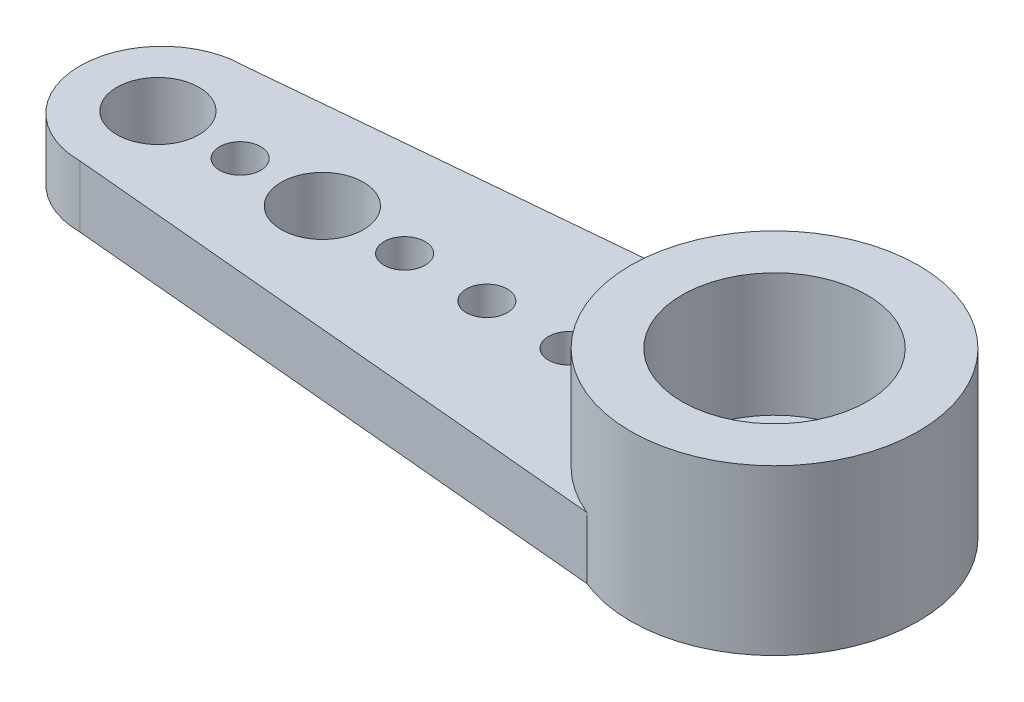
ISO-10303-21;
HEADER;
FILE_DESCRIPTION(('STEP AP214'),'2;1');
FILE_NAME('part.step','',(''),(''),'','','');
FILE_SCHEMA(('AUTOMOTIVE_DESIGN { 1 0 10303 214 1 1 1 1 }'));
ENDSEC;
DATA;
#1=APPLICATION_CONTEXT('core data for automotive mechanical design processes');
#2=APPLICATION_PROTOCOL_DEFINITION('international standard','automotive_design',2000,#1);
#3=PRODUCT_CONTEXT('',#1,'mechanical');
#4=PRODUCT('Part','Part','',(#3));
#5=PRODUCT_RELATED_PRODUCT_CATEGORY('part','',(#4));
#6=PRODUCT_DEFINITION_FORMATION('','',#4);
#7=PRODUCT_DEFINITION_CONTEXT('part definition',#1,'design');
#8=PRODUCT_DEFINITION('design','',#6,#7);
#9=PRODUCT_DEFINITION_SHAPE('','',#8);
#10=(LENGTH_UNIT() NAMED_UNIT(*) SI_UNIT(.MILLI.,.METRE.));
#11=(NAMED_UNIT(*) PLANE_ANGLE_UNIT() SI_UNIT($,.RADIAN.));
#12=(NAMED_UNIT(*) SI_UNIT($,.STERADIAN.) SOLID_ANGLE_UNIT());
#13=UNCERTAINTY_MEASURE_WITH_UNIT(LENGTH_MEASURE(1.E-05),#10,'distance_accuracy_value','');
#14=(GEOMETRIC_REPRESENTATION_CONTEXT(3) GLOBAL_UNCERTAINTY_ASSIGNED_CONTEXT((#13)) GLOBAL_UNIT_ASSIGNED_CONTEXT((#10,
#11,#12)) REPRESENTATION_CONTEXT('',''));
#15=CARTESIAN_POINT('',(0.,0.,0.));
#16=DIRECTION('',(0.,0.,1.));
#17=DIRECTION('',(1.,0.,0.));
#18=AXIS2_PLACEMENT_3D('',#15,#16,#17);
#19=CARTESIAN_POINT('',(0.,4.,0.));
#20=DIRECTION('',(0.,-1.,0.));
#21=DIRECTION('',(0.,0.,-1.));
#22=AXIS2_PLACEMENT_3D('',#19,#20,#21);
#23=CYLINDRICAL_SURFACE('',#22,3.5);
#24=CARTESIAN_POINT('',(0.,0.,0.));
#25=DIRECTION('',(0.,1.,0.));
#26=DIRECTION('',(0.,0.,1.));
#27=AXIS2_PLACEMENT_3D('',#24,#25,#26);
#28=CIRCLE('',#27,3.5);
#29=CARTESIAN_POINT('',(-1.32419778955484,0.,3.23983027551415));
#30=VERTEX_POINT('',#29);
#31=CARTESIAN_POINT('',(-1.32419778955674,0.,-3.23983027551337));
#32=VERTEX_POINT('',#31);
#33=EDGE_CURVE('E116',#30,#32,#28,.T.);
#34=ORIENTED_EDGE('',*,*,#33,.T.);
#35=DIRECTION('',(0.,-1.,0.));
#36=VECTOR('',#35,1.);
#37=CARTESIAN_POINT('',(-1.32419778955674,4.,-3.23983027551337));
#38=LINE('',#37,#36);
#39=CARTESIAN_POINT('',(-1.32419778955674,1.5,-3.23983027551337));
#40=VERTEX_POINT('',#39);
#41=EDGE_CURVE('E55',#40,#32,#38,.T.);
#42=ORIENTED_EDGE('',*,*,#41,.F.);
#43=CARTESIAN_POINT('',(0.,1.5,0.));
#44=DIRECTION('',(0.,-1.,0.));
#45=DIRECTION('',(0.,0.,-1.));
#46=AXIS2_PLACEMENT_3D('',#43,#44,#45);
#47=CIRCLE('',#46,3.5);
#48=CARTESIAN_POINT('',(-1.32419778955484,1.5,3.23983027551415));
#49=VERTEX_POINT('',#48);
#50=EDGE_CURVE('E11',#49,#40,#47,.T.);
#51=ORIENTED_EDGE('',*,*,#50,.F.);
#52=DIRECTION('',(0.,-1.,0.));
#53=VECTOR('',#52,1.);
#54=CARTESIAN_POINT('',(-1.32419778955484,4.,3.23983027551415));
#55=LINE('',#54,#53);
#56=EDGE_CURVE('E114',#30,#49,#55,.F.);
#57=ORIENTED_EDGE('',*,*,#56,.F.);
#58=EDGE_LOOP('',(#34,#42,#51,#57));
#59=FACE_BOUND('',#58,.T.);
#60=CARTESIAN_POINT('',(0.,4.,0.));
#61=DIRECTION('',(0.,1.,0.));
#62=DIRECTION('',(0.,0.,1.));
#63=AXIS2_PLACEMENT_3D('',#60,#61,#62);
#64=CIRCLE('',#63,3.5);
#65=CARTESIAN_POINT('',(0.,4.,3.5));
#66=VERTEX_POINT('',#65);
#67=EDGE_CURVE('E47',#66,#66,#64,.T.);
#68=ORIENTED_EDGE('',*,*,#67,.F.);
#69=EDGE_LOOP('',(#68));
#70=FACE_BOUND('',#69,.T.);
#71=ADVANCED_FACE('F39',(#59,#70),#23,.T.);
#72=CARTESIAN_POINT('',(0.,4.,0.));
#73=DIRECTION('',(0.,1.,0.));
#74=DIRECTION('',(0.,0.,1.));
#75=AXIS2_PLACEMENT_3D('',#72,#73,#74);
#76=PLANE('',#75);
#77=CARTESIAN_POINT('',(0.,4.,0.));
#78=DIRECTION('',(0.,1.,0.));
#79=DIRECTION('',(0.,0.,1.));
#80=AXIS2_PLACEMENT_3D('',#77,#78,#79);
#81=CIRCLE('',#80,2.25);
#82=CARTESIAN_POINT('',(0.,4.,2.25));
#83=VERTEX_POINT('',#82);
#84=EDGE_CURVE('E123',#83,#83,#81,.T.);
#85=ORIENTED_EDGE('',*,*,#84,.F.);
#86=EDGE_LOOP('',(#85));
#87=FACE_BOUND('',#86,.T.);
#88=ORIENTED_EDGE('',*,*,#67,.T.);
#89=EDGE_LOOP('',(#88));
#90=FACE_BOUND('',#89,.T.);
#91=ADVANCED_FACE('F178',(#87,#90),#76,.T.);
#92=CARTESIAN_POINT('',(0.,0.,0.));
#93=DIRECTION('',(0.,1.,0.));
#94=DIRECTION('',(0.,0.,1.));
#95=AXIS2_PLACEMENT_3D('',#92,#93,#94);
#96=PLANE('',#95);
#97=CARTESIAN_POINT('',(-5.,0.,0.));
#98=DIRECTION('',(0.,-1.,0.));
#99=DIRECTION('',(0.,0.,-1.));
#100=AXIS2_PLACEMENT_3D('',#97,#98,#99);
#101=CIRCLE('',#100,0.499999999999999);
#102=CARTESIAN_POINT('',(-5.,0.,-0.499999999999999));
#103=VERTEX_POINT('',#102);
#104=EDGE_CURVE('E152',#103,#103,#101,.T.);
#105=ORIENTED_EDGE('',*,*,#104,.F.);
#106=EDGE_LOOP('',(#105));
#107=FACE_BOUND('',#106,.T.);
#108=CARTESIAN_POINT('',(-7.,0.,0.));
#109=DIRECTION('',(0.,-1.,0.));
#110=DIRECTION('',(0.,0.,-1.));
#111=AXIS2_PLACEMENT_3D('',#108,#109,#110);
#112=CIRCLE('',#111,0.499999999999999);
#113=CARTESIAN_POINT('',(-7.,0.,-0.499999999999999));
#114=VERTEX_POINT('',#113);
#115=EDGE_CURVE('E142',#114,#114,#112,.T.);
#116=ORIENTED_EDGE('',*,*,#115,.F.);
#117=EDGE_LOOP('',(#116));
#118=FACE_BOUND('',#117,.T.);
#119=CARTESIAN_POINT('',(-9.,0.,0.));
#120=DIRECTION('',(0.,-1.,0.));
#121=DIRECTION('',(0.,0.,-1.));
#122=AXIS2_PLACEMENT_3D('',#119,#120,#121);
#123=CIRCLE('',#122,0.499999999999999);
#124=CARTESIAN_POINT('',(-9.,0.,-0.499999999999999));
#125=VERTEX_POINT('',#124);
#126=EDGE_CURVE('E139',#125,#125,#123,.T.);
#127=ORIENTED_EDGE('',*,*,#126,.F.);
#128=EDGE_LOOP('',(#127));
#129=FACE_BOUND('',#128,.T.);
#130=CARTESIAN_POINT('',(-11.,0.,0.));
#131=DIRECTION('',(0.,-1.,0.));
#132=DIRECTION('',(0.,0.,-1.));
#133=AXIS2_PLACEMENT_3D('',#130,#131,#132);
#134=CIRCLE('',#133,1.);
#135=CARTESIAN_POINT('',(-11.,0.,-1.));
#136=VERTEX_POINT('',#135);
#137=EDGE_CURVE('E136',#136,#136,#134,.T.);
#138=ORIENTED_EDGE('',*,*,#137,.F.);
#139=EDGE_LOOP('',(#138));
#140=FACE_BOUND('',#139,.T.);
#141=CARTESIAN_POINT('',(-13.,0.,0.));
#142=DIRECTION('',(0.,-1.,0.));
#143=DIRECTION('',(0.,0.,-1.));
#144=AXIS2_PLACEMENT_3D('',#141,#142,#143);
#145=CIRCLE('',#144,0.499999999999999);
#146=CARTESIAN_POINT('',(-13.,0.,-0.499999999999999));
#147=VERTEX_POINT('',#146);
#148=EDGE_CURVE('E132',#147,#147,#145,.T.);
#149=ORIENTED_EDGE('',*,*,#148,.F.);
#150=EDGE_LOOP('',(#149));
#151=FACE_BOUND('',#150,.T.);
#152=CARTESIAN_POINT('',(-15.,0.,0.));
#153=DIRECTION('',(0.,-1.,0.));
#154=DIRECTION('',(0.,0.,-1.));
#155=AXIS2_PLACEMENT_3D('',#152,#153,#154);
#156=CIRCLE('',#155,1.);
#157=CARTESIAN_POINT('',(-15.,0.,-1.));
#158=VERTEX_POINT('',#157);
#159=EDGE_CURVE('E128',#158,#158,#156,.T.);
#160=ORIENTED_EDGE('',*,*,#159,.F.);
#161=EDGE_LOOP('',(#160));
#162=FACE_BOUND('',#161,.T.);
#163=CARTESIAN_POINT('',(0.,0.,0.));
#164=DIRECTION('',(0.,-1.,0.));
#165=DIRECTION('',(0.,0.,-1.));
#166=AXIS2_PLACEMENT_3D('',#163,#164,#165);
#167=CIRCLE('',#166,2.5);
#168=CARTESIAN_POINT('',(0.,0.,-2.5));
#169=VERTEX_POINT('',#168);
#170=EDGE_CURVE('E104',#169,#169,#167,.T.);
#171=ORIENTED_EDGE('',*,*,#170,.F.);
#172=EDGE_LOOP('',(#171));
#173=FACE_BOUND('',#172,.T.);
#174=ORIENTED_EDGE('',*,*,#33,.F.);
#175=DIRECTION('',(0.995855643356441,0.,0.0909479939038128));
#176=VECTOR('',#175,1.);
#177=CARTESIAN_POINT('',(-14.9,0.,2.));
#178=LINE('',#177,#176);
#179=CARTESIAN_POINT('',(-14.9,0.,2.));
#180=VERTEX_POINT('',#179);
#181=EDGE_CURVE('E99',#180,#30,#178,.T.);
#182=ORIENTED_EDGE('',*,*,#181,.F.);
#183=CARTESIAN_POINT('',(-14.9,0.,0.));
#184=DIRECTION('',(0.,-1.,0.));
#185=DIRECTION('',(0.,0.,-1.));
#186=AXIS2_PLACEMENT_3D('',#183,#184,#185);
#187=CIRCLE('',#186,2.);
#188=CARTESIAN_POINT('',(-14.9,0.,-2.));
#189=VERTEX_POINT('',#188);
#190=EDGE_CURVE('E108',#180,#189,#187,.T.);
#191=ORIENTED_EDGE('',*,*,#190,.T.);
#192=DIRECTION('',(-0.995855643356445,0.,0.090947993903769));
#193=VECTOR('',#192,1.);
#194=CARTESIAN_POINT('',(-0.6499999999969,0.,-3.30140238876481));
#195=LINE('',#194,#193);
#196=EDGE_CURVE('E91',#32,#189,#195,.T.);
#197=ORIENTED_EDGE('',*,*,#196,.F.);
#198=EDGE_LOOP('',(#174,#182,#191,#197));
#199=FACE_BOUND('',#198,.T.);
#200=ADVANCED_FACE('F175',(#107,#118,#129,#140,#151,#162,#173,#199),#96,.F.);
#201=CARTESIAN_POINT('',(-14.9,1.5,0.));
#202=DIRECTION('',(0.,-1.,0.));
#203=DIRECTION('',(0.,0.,-1.));
#204=AXIS2_PLACEMENT_3D('',#201,#202,#203);
#205=PLANE('',#204);
#206=CARTESIAN_POINT('',(-5.,1.5,0.));
#207=DIRECTION('',(0.,-1.,0.));
#208=DIRECTION('',(0.,0.,-1.));
#209=AXIS2_PLACEMENT_3D('',#206,#207,#208);
#210=CIRCLE('',#209,0.499999999999999);
#211=CARTESIAN_POINT('',(-5.,1.5,-0.499999999999999));
#212=VERTEX_POINT('',#211);
#213=EDGE_CURVE('E42',#212,#212,#210,.T.);
#214=ORIENTED_EDGE('',*,*,#213,.T.);
#215=EDGE_LOOP('',(#214));
#216=FACE_BOUND('',#215,.T.);
#217=CARTESIAN_POINT('',(-7.,1.5,0.));
#218=DIRECTION('',(0.,-1.,0.));
#219=DIRECTION('',(0.,0.,-1.));
#220=AXIS2_PLACEMENT_3D('',#217,#218,#219);
#221=CIRCLE('',#220,0.499999999999999);
#222=CARTESIAN_POINT('',(-7.,1.5,-0.499999999999999));
#223=VERTEX_POINT('',#222);
#224=EDGE_CURVE('E140',#223,#223,#221,.T.);
#225=ORIENTED_EDGE('',*,*,#224,.T.);
#226=EDGE_LOOP('',(#225));
#227=FACE_BOUND('',#226,.T.);
#228=CARTESIAN_POINT('',(-9.,1.5,0.));
#229=DIRECTION('',(0.,-1.,0.));
#230=DIRECTION('',(0.,0.,-1.));
#231=AXIS2_PLACEMENT_3D('',#228,#229,#230);
#232=CIRCLE('',#231,0.499999999999999);
#233=CARTESIAN_POINT('',(-9.,1.5,-0.499999999999999));
#234=VERTEX_POINT('',#233);
#235=EDGE_CURVE('E137',#234,#234,#232,.T.);
#236=ORIENTED_EDGE('',*,*,#235,.T.);
#237=EDGE_LOOP('',(#236));
#238=FACE_BOUND('',#237,.T.);
#239=CARTESIAN_POINT('',(-11.,1.5,0.));
#240=DIRECTION('',(0.,-1.,0.));
#241=DIRECTION('',(0.,0.,-1.));
#242=AXIS2_PLACEMENT_3D('',#239,#240,#241);
#243=CIRCLE('',#242,1.);
#244=CARTESIAN_POINT('',(-11.,1.5,-1.));
#245=VERTEX_POINT('',#244);
#246=EDGE_CURVE('E133',#245,#245,#243,.T.);
#247=ORIENTED_EDGE('',*,*,#246,.T.);
#248=EDGE_LOOP('',(#247));
#249=FACE_BOUND('',#248,.T.);
#250=CARTESIAN_POINT('',(-13.,1.5,0.));
#251=DIRECTION('',(0.,-1.,0.));
#252=DIRECTION('',(0.,0.,-1.));
#253=AXIS2_PLACEMENT_3D('',#250,#251,#252);
#254=CIRCLE('',#253,0.499999999999999);
#255=CARTESIAN_POINT('',(-13.,1.5,-0.499999999999999));
#256=VERTEX_POINT('',#255);
#257=EDGE_CURVE('E129',#256,#256,#254,.T.);
#258=ORIENTED_EDGE('',*,*,#257,.T.);
#259=EDGE_LOOP('',(#258));
#260=FACE_BOUND('',#259,.T.);
#261=CARTESIAN_POINT('',(-15.,1.5,0.));
#262=DIRECTION('',(0.,-1.,0.));
#263=DIRECTION('',(0.,0.,-1.));
#264=AXIS2_PLACEMENT_3D('',#261,#262,#263);
#265=CIRCLE('',#264,1.);
#266=CARTESIAN_POINT('',(-15.,1.5,-1.));
#267=VERTEX_POINT('',#266);
#268=EDGE_CURVE('E125',#267,#267,#265,.T.);
#269=ORIENTED_EDGE('',*,*,#268,.T.);
#270=EDGE_LOOP('',(#269));
#271=FACE_BOUND('',#270,.T.);
#272=DIRECTION('',(0.995855643356441,0.,0.0909479939038128));
#273=VECTOR('',#272,1.);
#274=CARTESIAN_POINT('',(-14.9,1.5,2.));
#275=LINE('',#274,#273);
#276=CARTESIAN_POINT('',(-14.9,1.5,2.));
#277=VERTEX_POINT('',#276);
#278=EDGE_CURVE('E85',#277,#49,#275,.T.);
#279=ORIENTED_EDGE('',*,*,#278,.T.);
#280=ORIENTED_EDGE('',*,*,#50,.T.);
#281=DIRECTION('',(-0.995855643356445,0.,0.090947993903769));
#282=VECTOR('',#281,1.);
#283=CARTESIAN_POINT('',(-0.6499999999969,1.5,-3.30140238876481));
#284=LINE('',#283,#282);
#285=CARTESIAN_POINT('',(-14.9,1.5,-2.));
#286=VERTEX_POINT('',#285);
#287=EDGE_CURVE('E78',#40,#286,#284,.T.);
#288=ORIENTED_EDGE('',*,*,#287,.T.);
#289=CARTESIAN_POINT('',(-14.9,1.5,0.));
#290=DIRECTION('',(0.,-1.,0.));
#291=DIRECTION('',(0.,0.,-1.));
#292=AXIS2_PLACEMENT_3D('',#289,#290,#291);
#293=CIRCLE('',#292,2.);
#294=EDGE_CURVE('E83',#277,#286,#293,.T.);
#295=ORIENTED_EDGE('',*,*,#294,.F.);
#296=EDGE_LOOP('',(#279,#280,#288,#295));
#297=FACE_BOUND('',#296,.T.);
#298=ADVANCED_FACE('F81',(#216,#227,#238,#249,#260,#271,#297),#205,.F.);
#299=CARTESIAN_POINT('',(-14.9,1.5,2.));
#300=DIRECTION('',(0.0909479939038128,0.,-0.995855643356442));
#301=DIRECTION('',(-0.995855643356442,0.,-0.0909479939038128));
#302=AXIS2_PLACEMENT_3D('',#299,#300,#301);
#303=PLANE('',#302);
#304=ORIENTED_EDGE('',*,*,#181,.T.);
#305=ORIENTED_EDGE('',*,*,#56,.T.);
#306=ORIENTED_EDGE('',*,*,#278,.F.);
#307=DIRECTION('',(0.,-1.,0.));
#308=VECTOR('',#307,1.);
#309=CARTESIAN_POINT('',(-14.9,1.5,2.));
#310=LINE('',#309,#308);
#311=EDGE_CURVE('E95',#277,#180,#310,.T.);
#312=ORIENTED_EDGE('',*,*,#311,.T.);
#313=EDGE_LOOP('',(#304,#305,#306,#312));
#314=FACE_BOUND('',#313,.T.);
#315=ADVANCED_FACE('F183',(#314),#303,.F.);
#316=CARTESIAN_POINT('',(-0.6499999999969,1.5,-3.30140238876481));
#317=DIRECTION('',(0.090947993903769,0.,0.995855643356445));
#318=DIRECTION('',(0.995855643356445,0.,-0.090947993903769));
#319=AXIS2_PLACEMENT_3D('',#316,#317,#318);
#320=PLANE('',#319);
#321=ORIENTED_EDGE('',*,*,#287,.F.);
#322=ORIENTED_EDGE('',*,*,#41,.T.);
#323=ORIENTED_EDGE('',*,*,#196,.T.);
#324=DIRECTION('',(0.,-1.,0.));
#325=VECTOR('',#324,1.);
#326=CARTESIAN_POINT('',(-14.9,1.5,-2.));
#327=LINE('',#326,#325);
#328=EDGE_CURVE('E88',#286,#189,#327,.T.);
#329=ORIENTED_EDGE('',*,*,#328,.F.);
#330=EDGE_LOOP('',(#321,#322,#323,#329));
#331=FACE_BOUND('',#330,.T.);
#332=ADVANCED_FACE('F89',(#331),#320,.F.);
#333=CARTESIAN_POINT('',(-14.9,1.5,0.));
#334=DIRECTION('',(0.,-1.,0.));
#335=DIRECTION('',(0.,0.,-1.));
#336=AXIS2_PLACEMENT_3D('',#333,#334,#335);
#337=CYLINDRICAL_SURFACE('',#336,2.);
#338=ORIENTED_EDGE('',*,*,#190,.F.);
#339=ORIENTED_EDGE('',*,*,#311,.F.);
#340=ORIENTED_EDGE('',*,*,#294,.T.);
#341=ORIENTED_EDGE('',*,*,#328,.T.);
#342=EDGE_LOOP('',(#338,#339,#340,#341));
#343=FACE_BOUND('',#342,.T.);
#344=ADVANCED_FACE('F97',(#343),#337,.T.);
#345=CARTESIAN_POINT('',(0.,0.6,0.));
#346=DIRECTION('',(0.,-1.,0.));
#347=DIRECTION('',(0.,0.,-1.));
#348=AXIS2_PLACEMENT_3D('',#345,#346,#347);
#349=CYLINDRICAL_SURFACE('',#348,2.5);
#350=CARTESIAN_POINT('',(0.,0.6,0.));
#351=DIRECTION('',(0.,-1.,0.));
#352=DIRECTION('',(0.,0.,-1.));
#353=AXIS2_PLACEMENT_3D('',#350,#351,#352);
#354=CIRCLE('',#353,2.5);
#355=CARTESIAN_POINT('',(0.,0.6,-2.5));
#356=VERTEX_POINT('',#355);
#357=EDGE_CURVE('E110',#356,#356,#354,.T.);
#358=ORIENTED_EDGE('',*,*,#357,.F.);
#359=EDGE_LOOP('',(#358));
#360=FACE_BOUND('',#359,.T.);
#361=ORIENTED_EDGE('',*,*,#170,.T.);
#362=EDGE_LOOP('',(#361));
#363=FACE_BOUND('',#362,.T.);
#364=ADVANCED_FACE('F173',(#360,#363),#349,.F.);
#365=CARTESIAN_POINT('',(0.,0.6,0.));
#366=DIRECTION('',(0.,-1.,0.));
#367=DIRECTION('',(0.,0.,-1.));
#368=AXIS2_PLACEMENT_3D('',#365,#366,#367);
#369=PLANE('',#368);
#370=CARTESIAN_POINT('',(0.,0.6,0.));
#371=DIRECTION('',(0.,-1.,0.));
#372=DIRECTION('',(0.,0.,-1.));
#373=AXIS2_PLACEMENT_3D('',#370,#371,#372);
#374=CIRCLE('',#373,1.);
#375=CARTESIAN_POINT('',(0.,0.6,-1.));
#376=VERTEX_POINT('',#375);
#377=EDGE_CURVE('E124',#376,#376,#374,.T.);
#378=ORIENTED_EDGE('',*,*,#377,.F.);
#379=EDGE_LOOP('',(#378));
#380=FACE_BOUND('',#379,.T.);
#381=ORIENTED_EDGE('',*,*,#357,.T.);
#382=EDGE_LOOP('',(#381));
#383=FACE_BOUND('',#382,.T.);
#384=ADVANCED_FACE('F209',(#380,#383),#369,.T.);
#385=CARTESIAN_POINT('',(0.,1.,0.));
#386=DIRECTION('',(0.,1.,0.));
#387=DIRECTION('',(0.,0.,1.));
#388=AXIS2_PLACEMENT_3D('',#385,#386,#387);
#389=CYLINDRICAL_SURFACE('',#388,2.25);
#390=CARTESIAN_POINT('',(0.,1.,0.));
#391=DIRECTION('',(0.,1.,0.));
#392=DIRECTION('',(0.,0.,1.));
#393=AXIS2_PLACEMENT_3D('',#390,#391,#392);
#394=CIRCLE('',#393,2.25);
#395=CARTESIAN_POINT('',(0.,1.,2.25));
#396=VERTEX_POINT('',#395);
#397=EDGE_CURVE('E163',#396,#396,#394,.T.);
#398=ORIENTED_EDGE('',*,*,#397,.F.);
#399=EDGE_LOOP('',(#398));
#400=FACE_BOUND('',#399,.T.);
#401=ORIENTED_EDGE('',*,*,#84,.T.);
#402=EDGE_LOOP('',(#401));
#403=FACE_BOUND('',#402,.T.);
#404=ADVANCED_FACE('F215',(#400,#403),#389,.F.);
#405=CARTESIAN_POINT('',(0.,1.,0.));
#406=DIRECTION('',(0.,1.,0.));
#407=DIRECTION('',(0.,0.,1.));
#408=AXIS2_PLACEMENT_3D('',#405,#406,#407);
#409=PLANE('',#408);
#410=CARTESIAN_POINT('',(0.,1.,0.));
#411=DIRECTION('',(0.,1.,0.));
#412=DIRECTION('',(0.,0.,1.));
#413=AXIS2_PLACEMENT_3D('',#410,#411,#412);
#414=CIRCLE('',#413,1.);
#415=CARTESIAN_POINT('',(0.,1.,1.));
#416=VERTEX_POINT('',#415);
#417=EDGE_CURVE('E120',#416,#416,#414,.T.);
#418=ORIENTED_EDGE('',*,*,#417,.F.);
#419=EDGE_LOOP('',(#418));
#420=FACE_BOUND('',#419,.T.);
#421=ORIENTED_EDGE('',*,*,#397,.T.);
#422=EDGE_LOOP('',(#421));
#423=FACE_BOUND('',#422,.T.);
#424=ADVANCED_FACE('F220',(#420,#423),#409,.T.);
#425=CARTESIAN_POINT('',(0.,4.,0.));
#426=DIRECTION('',(0.,-1.,0.));
#427=DIRECTION('',(0.,0.,-1.));
#428=AXIS2_PLACEMENT_3D('',#425,#426,#427);
#429=CYLINDRICAL_SURFACE('',#428,1.);
#430=ORIENTED_EDGE('',*,*,#417,.T.);
#431=EDGE_LOOP('',(#430));
#432=FACE_BOUND('',#431,.T.);
#433=ORIENTED_EDGE('',*,*,#377,.T.);
#434=EDGE_LOOP('',(#433));
#435=FACE_BOUND('',#434,.T.);
#436=ADVANCED_FACE('F224',(#432,#435),#429,.F.);
#437=CARTESIAN_POINT('',(-15.,4.,0.));
#438=DIRECTION('',(0.,-1.,0.));
#439=DIRECTION('',(0.,0.,-1.));
#440=AXIS2_PLACEMENT_3D('',#437,#438,#439);
#441=CYLINDRICAL_SURFACE('',#440,1.);
#442=ORIENTED_EDGE('',*,*,#159,.T.);
#443=EDGE_LOOP('',(#442));
#444=FACE_BOUND('',#443,.T.);
#445=ORIENTED_EDGE('',*,*,#268,.F.);
#446=EDGE_LOOP('',(#445));
#447=FACE_BOUND('',#446,.T.);
#448=ADVANCED_FACE('F228',(#444,#447),#441,.F.);
#449=CARTESIAN_POINT('',(-13.,4.,0.));
#450=DIRECTION('',(0.,-1.,0.));
#451=DIRECTION('',(0.,0.,-1.));
#452=AXIS2_PLACEMENT_3D('',#449,#450,#451);
#453=CYLINDRICAL_SURFACE('',#452,0.499999999999999);
#454=ORIENTED_EDGE('',*,*,#148,.T.);
#455=EDGE_LOOP('',(#454));
#456=FACE_BOUND('',#455,.T.);
#457=ORIENTED_EDGE('',*,*,#257,.F.);
#458=EDGE_LOOP('',(#457));
#459=FACE_BOUND('',#458,.T.);
#460=ADVANCED_FACE('F232',(#456,#459),#453,.F.);
#461=CARTESIAN_POINT('',(-11.,4.,0.));
#462=DIRECTION('',(0.,-1.,0.));
#463=DIRECTION('',(0.,0.,-1.));
#464=AXIS2_PLACEMENT_3D('',#461,#462,#463);
#465=CYLINDRICAL_SURFACE('',#464,1.);
#466=ORIENTED_EDGE('',*,*,#137,.T.);
#467=EDGE_LOOP('',(#466));
#468=FACE_BOUND('',#467,.T.);
#469=ORIENTED_EDGE('',*,*,#246,.F.);
#470=EDGE_LOOP('',(#469));
#471=FACE_BOUND('',#470,.T.);
#472=ADVANCED_FACE('F236',(#468,#471),#465,.F.);
#473=CARTESIAN_POINT('',(-9.,4.,0.));
#474=DIRECTION('',(0.,-1.,0.));
#475=DIRECTION('',(0.,0.,-1.));
#476=AXIS2_PLACEMENT_3D('',#473,#474,#475);
#477=CYLINDRICAL_SURFACE('',#476,0.499999999999999);
#478=ORIENTED_EDGE('',*,*,#126,.T.);
#479=EDGE_LOOP('',(#478));
#480=FACE_BOUND('',#479,.T.);
#481=ORIENTED_EDGE('',*,*,#235,.F.);
#482=EDGE_LOOP('',(#481));
#483=FACE_BOUND('',#482,.T.);
#484=ADVANCED_FACE('F240',(#480,#483),#477,.F.);
#485=CARTESIAN_POINT('',(-7.,4.,0.));
#486=DIRECTION('',(0.,-1.,0.));
#487=DIRECTION('',(0.,0.,-1.));
#488=AXIS2_PLACEMENT_3D('',#485,#486,#487);
#489=CYLINDRICAL_SURFACE('',#488,0.499999999999999);
#490=ORIENTED_EDGE('',*,*,#115,.T.);
#491=EDGE_LOOP('',(#490));
#492=FACE_BOUND('',#491,.T.);
#493=ORIENTED_EDGE('',*,*,#224,.F.);
#494=EDGE_LOOP('',(#493));
#495=FACE_BOUND('',#494,.T.);
#496=ADVANCED_FACE('F244',(#492,#495),#489,.F.);
#497=CARTESIAN_POINT('',(-5.,4.,0.));
#498=DIRECTION('',(0.,-1.,0.));
#499=DIRECTION('',(0.,0.,-1.));
#500=AXIS2_PLACEMENT_3D('',#497,#498,#499);
#501=CYLINDRICAL_SURFACE('',#500,0.499999999999999);
#502=ORIENTED_EDGE('',*,*,#104,.T.);
#503=EDGE_LOOP('',(#502));
#504=FACE_BOUND('',#503,.T.);
#505=ORIENTED_EDGE('',*,*,#213,.F.);
#506=EDGE_LOOP('',(#505));
#507=FACE_BOUND('',#506,.T.);
#508=ADVANCED_FACE('F248',(#504,#507),#501,.F.);
#509=CLOSED_SHELL('',(#71,#91,#200,#298,#315,#332,#344,#364,#384,#404,#424,#436,#448,#460,#472,
#484,#496,#508));
#510=MANIFOLD_SOLID_BREP('B2',#509);
#511=ADVANCED_BREP_SHAPE_REPRESENTATION('',(#18,#510),#14);
#512=SHAPE_DEFINITION_REPRESENTATION(#9,#511);
ENDSEC;
END-ISO-10303-21;
